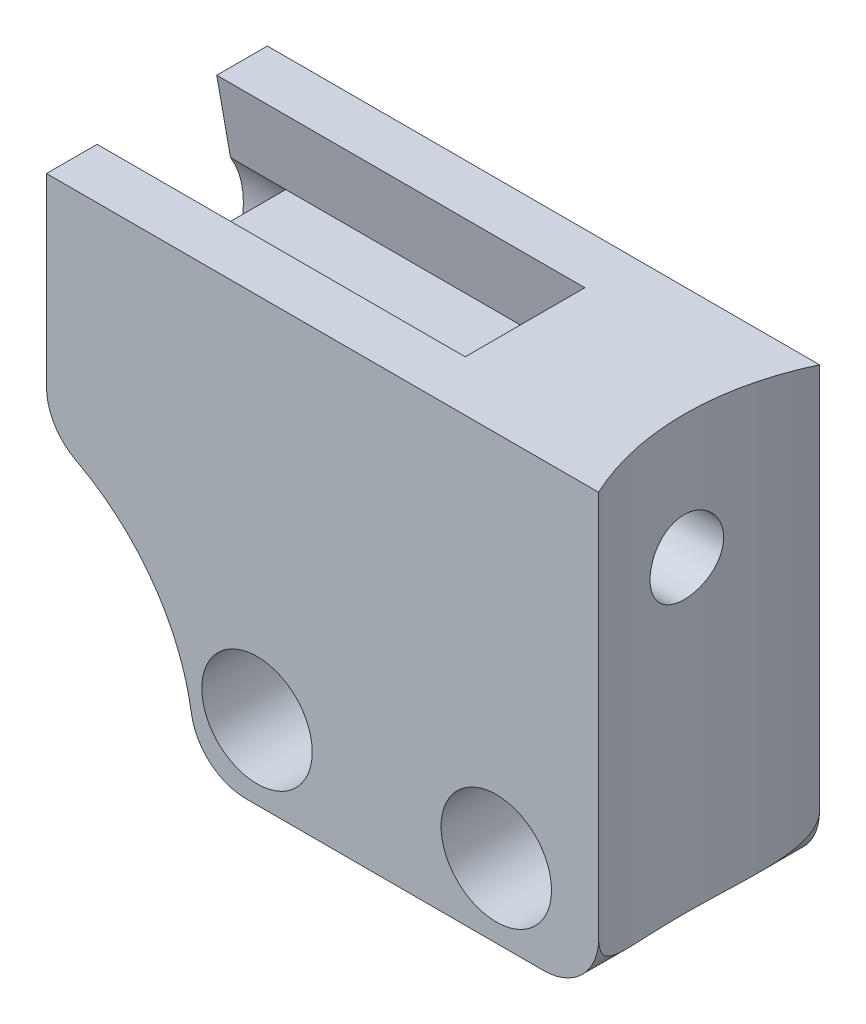
ISO-10303-21;
HEADER;
FILE_DESCRIPTION(('STEP AP214'),'2;1');
FILE_NAME('part.step','',(''),(''),'','','');
FILE_SCHEMA(('AUTOMOTIVE_DESIGN { 1 0 10303 214 1 1 1 1 }'));
ENDSEC;
DATA;
#1=APPLICATION_CONTEXT('core data for automotive mechanical design processes');
#2=APPLICATION_PROTOCOL_DEFINITION('international standard','automotive_design',2000,#1);
#3=PRODUCT_CONTEXT('',#1,'mechanical');
#4=PRODUCT('Part','Part','',(#3));
#5=PRODUCT_RELATED_PRODUCT_CATEGORY('part','',(#4));
#6=PRODUCT_DEFINITION_FORMATION('','',#4);
#7=PRODUCT_DEFINITION_CONTEXT('part definition',#1,'design');
#8=PRODUCT_DEFINITION('design','',#6,#7);
#9=PRODUCT_DEFINITION_SHAPE('','',#8);
#10=(LENGTH_UNIT() NAMED_UNIT(*) SI_UNIT(.MILLI.,.METRE.));
#11=(NAMED_UNIT(*) PLANE_ANGLE_UNIT() SI_UNIT($,.RADIAN.));
#12=(NAMED_UNIT(*) SI_UNIT($,.STERADIAN.) SOLID_ANGLE_UNIT());
#13=UNCERTAINTY_MEASURE_WITH_UNIT(LENGTH_MEASURE(1.E-05),#10,'distance_accuracy_value','');
#14=(GEOMETRIC_REPRESENTATION_CONTEXT(3) GLOBAL_UNCERTAINTY_ASSIGNED_CONTEXT((#13)) GLOBAL_UNIT_ASSIGNED_CONTEXT((#10,
#11,#12)) REPRESENTATION_CONTEXT('',''));
#15=CARTESIAN_POINT('',(0.,0.,0.));
#16=DIRECTION('',(0.,0.,1.));
#17=DIRECTION('',(1.,0.,0.));
#18=AXIS2_PLACEMENT_3D('',#15,#16,#17);
#19=CARTESIAN_POINT('',(-15.,12.,6.));
#20=DIRECTION('',(1.,0.,0.));
#21=DIRECTION('',(0.,0.,-1.));
#22=AXIS2_PLACEMENT_3D('',#19,#20,#21);
#23=PLANE('',#22);
#24=DIRECTION('',(0.,-0.984807753012207,0.173648177666935));
#25=VECTOR('',#24,1.);
#26=CARTESIAN_POINT('',(-15.,0.917627008188793,5.20412136873116));
#27=LINE('',#26,#25);
#28=CARTESIAN_POINT('',(-15.,12.,3.25));
#29=VERTEX_POINT('',#28);
#30=CARTESIAN_POINT('',(-15.,7.74653863528683,4.));
#31=VERTEX_POINT('',#30);
#32=EDGE_CURVE('E233',#29,#31,#27,.T.);
#33=ORIENTED_EDGE('',*,*,#32,.T.);
#34=CARTESIAN_POINT('',(-15.,5.27874609943621,0.));
#35=DIRECTION('',(-1.,0.,0.));
#36=DIRECTION('',(0.,0.,1.));
#37=AXIS2_PLACEMENT_3D('',#34,#35,#36);
#38=CIRCLE('',#37,4.7);
#39=CARTESIAN_POINT('',(-15.,1.95614318103448,3.32420063272786));
#40=VERTEX_POINT('',#39);
#41=EDGE_CURVE('E237',#40,#31,#38,.T.);
#42=ORIENTED_EDGE('',*,*,#41,.F.);
#43=DIRECTION('',(0.,0.,-1.));
#44=VECTOR('',#43,1.);
#45=CARTESIAN_POINT('',(-15.,1.95614318103448,6.));
#46=LINE('',#45,#44);
#47=CARTESIAN_POINT('',(-15.,1.95614318103448,6.));
#48=VERTEX_POINT('',#47);
#49=EDGE_CURVE('E11',#48,#40,#46,.T.);
#50=ORIENTED_EDGE('',*,*,#49,.F.);
#51=DIRECTION('',(0.,-1.,0.));
#52=VECTOR('',#51,1.);
#53=CARTESIAN_POINT('',(-15.,12.,6.));
#54=LINE('',#53,#52);
#55=CARTESIAN_POINT('',(-15.,12.,6.));
#56=VERTEX_POINT('',#55);
#57=EDGE_CURVE('E186',#56,#48,#54,.T.);
#58=ORIENTED_EDGE('',*,*,#57,.F.);
#59=DIRECTION('',(0.,0.,-1.));
#60=VECTOR('',#59,1.);
#61=CARTESIAN_POINT('',(-15.,12.,6.));
#62=LINE('',#61,#60);
#63=EDGE_CURVE('E187',#56,#29,#62,.T.);
#64=ORIENTED_EDGE('',*,*,#63,.T.);
#65=EDGE_LOOP('',(#33,#42,#50,#58,#64));
#66=FACE_BOUND('',#65,.T.);
#67=ADVANCED_FACE('F38',(#66),#23,.F.);
#68=CARTESIAN_POINT('',(5.,7.74653863528683,0.));
#69=DIRECTION('',(0.,1.,0.));
#70=DIRECTION('',(0.,0.,1.));
#71=AXIS2_PLACEMENT_3D('',#68,#69,#70);
#72=PLANE('',#71);
#73=DIRECTION('',(-1.,0.,0.));
#74=VECTOR('',#73,1.);
#75=CARTESIAN_POINT('',(5.,7.74653863528683,-4.));
#76=LINE('',#75,#74);
#77=CARTESIAN_POINT('',(5.,7.74653863528683,-4.));
#78=VERTEX_POINT('',#77);
#79=CARTESIAN_POINT('',(-12.,7.74653863528683,-4.));
#80=VERTEX_POINT('',#79);
#81=EDGE_CURVE('E257',#78,#80,#76,.T.);
#82=ORIENTED_EDGE('',*,*,#81,.T.);
#83=DIRECTION('',(0.,0.,-1.));
#84=VECTOR('',#83,1.);
#85=CARTESIAN_POINT('',(-12.,7.74653863528683,-4.));
#86=LINE('',#85,#84);
#87=CARTESIAN_POINT('',(-12.,7.74653863528683,4.));
#88=VERTEX_POINT('',#87);
#89=EDGE_CURVE('E388',#88,#80,#86,.T.);
#90=ORIENTED_EDGE('',*,*,#89,.F.);
#91=DIRECTION('',(-1.,0.,0.));
#92=VECTOR('',#91,1.);
#93=CARTESIAN_POINT('',(5.,7.74653863528683,4.));
#94=LINE('',#93,#92);
#95=CARTESIAN_POINT('',(5.,7.74653863528683,4.));
#96=VERTEX_POINT('',#95);
#97=EDGE_CURVE('E269',#96,#88,#94,.T.);
#98=ORIENTED_EDGE('',*,*,#97,.F.);
#99=DIRECTION('',(0.,0.,-1.));
#100=VECTOR('',#99,1.);
#101=CARTESIAN_POINT('',(5.,7.74653863528683,0.));
#102=LINE('',#101,#100);
#103=EDGE_CURVE('E249',#96,#78,#102,.T.);
#104=ORIENTED_EDGE('',*,*,#103,.T.);
#105=EDGE_LOOP('',(#82,#90,#98,#104));
#106=FACE_BOUND('',#105,.T.);
#107=ADVANCED_FACE('F216',(#106),#72,.T.);
#108=CARTESIAN_POINT('',(-15.,1.95614318103448,-3.32420063272786));
#109=VERTEX_POINT('',#108);
#110=CARTESIAN_POINT('',(-15.,1.95614318103448,-6.));
#111=VERTEX_POINT('',#110);
#112=EDGE_CURVE('E53',#109,#111,#46,.T.);
#113=ORIENTED_EDGE('',*,*,#112,.F.);
#114=CARTESIAN_POINT('',(-15.,7.74653863528683,-4.));
#115=VERTEX_POINT('',#114);
#116=EDGE_CURVE('E381',#115,#109,#38,.T.);
#117=ORIENTED_EDGE('',*,*,#116,.F.);
#118=DIRECTION('',(0.,0.984807753012207,0.173648177666935));
#119=VECTOR('',#118,1.);
#120=CARTESIAN_POINT('',(-15.,0.917627008188794,-5.20412136873116));
#121=LINE('',#120,#119);
#122=CARTESIAN_POINT('',(-15.,12.,-3.25));
#123=VERTEX_POINT('',#122);
#124=EDGE_CURVE('E245',#115,#123,#121,.T.);
#125=ORIENTED_EDGE('',*,*,#124,.T.);
#126=CARTESIAN_POINT('',(-15.,12.,-6.));
#127=VERTEX_POINT('',#126);
#128=EDGE_CURVE('E101',#123,#127,#62,.T.);
#129=ORIENTED_EDGE('',*,*,#128,.T.);
#130=DIRECTION('',(0.,-1.,0.));
#131=VECTOR('',#130,1.);
#132=CARTESIAN_POINT('',(-15.,12.,-6.));
#133=LINE('',#132,#131);
#134=EDGE_CURVE('E160',#127,#111,#133,.T.);
#135=ORIENTED_EDGE('',*,*,#134,.T.);
#136=EDGE_LOOP('',(#113,#117,#125,#129,#135));
#137=FACE_BOUND('',#136,.T.);
#138=ADVANCED_FACE('F40',(#137),#23,.F.);
#139=CARTESIAN_POINT('',(-15.,12.,6.));
#140=DIRECTION('',(0.,-1.,0.));
#141=DIRECTION('',(0.,0.,-1.));
#142=AXIS2_PLACEMENT_3D('',#139,#140,#141);
#143=PLANE('',#142);
#144=DIRECTION('',(-1.,0.,0.));
#145=VECTOR('',#144,1.);
#146=CARTESIAN_POINT('',(-15.,12.,6.));
#147=LINE('',#146,#145);
#148=CARTESIAN_POINT('',(15.,12.,6.));
#149=VERTEX_POINT('',#148);
#150=EDGE_CURVE('E69',#149,#56,#147,.T.);
#151=ORIENTED_EDGE('',*,*,#150,.F.);
#152=CARTESIAN_POINT('',(27.6491106406735,12.,0.));
#153=DIRECTION('',(0.,1.,0.));
#154=DIRECTION('',(0.,0.,1.));
#155=AXIS2_PLACEMENT_3D('',#152,#153,#154);
#156=CIRCLE('',#155,14.);
#157=CARTESIAN_POINT('',(15.,12.,-6.));
#158=VERTEX_POINT('',#157);
#159=EDGE_CURVE('E359',#158,#149,#156,.T.);
#160=ORIENTED_EDGE('',*,*,#159,.F.);
#161=DIRECTION('',(-1.,0.,0.));
#162=VECTOR('',#161,1.);
#163=CARTESIAN_POINT('',(-15.,12.,-6.));
#164=LINE('',#163,#162);
#165=EDGE_CURVE('E183',#158,#127,#164,.T.);
#166=ORIENTED_EDGE('',*,*,#165,.T.);
#167=ORIENTED_EDGE('',*,*,#128,.F.);
#168=DIRECTION('',(-1.,0.,0.));
#169=VECTOR('',#168,1.);
#170=CARTESIAN_POINT('',(5.,12.,-3.25));
#171=LINE('',#170,#169);
#172=CARTESIAN_POINT('',(5.,12.,-3.25));
#173=VERTEX_POINT('',#172);
#174=EDGE_CURVE('E262',#173,#123,#171,.T.);
#175=ORIENTED_EDGE('',*,*,#174,.F.);
#176=DIRECTION('',(0.,0.,-1.));
#177=VECTOR('',#176,1.);
#178=CARTESIAN_POINT('',(5.,12.,0.));
#179=LINE('',#178,#177);
#180=CARTESIAN_POINT('',(5.,12.,3.25));
#181=VERTEX_POINT('',#180);
#182=EDGE_CURVE('E294',#181,#173,#179,.T.);
#183=ORIENTED_EDGE('',*,*,#182,.F.);
#184=DIRECTION('',(-1.,0.,0.));
#185=VECTOR('',#184,1.);
#186=CARTESIAN_POINT('',(5.,12.,3.25));
#187=LINE('',#186,#185);
#188=EDGE_CURVE('E266',#181,#29,#187,.T.);
#189=ORIENTED_EDGE('',*,*,#188,.T.);
#190=ORIENTED_EDGE('',*,*,#63,.F.);
#191=EDGE_LOOP('',(#151,#160,#166,#167,#175,#183,#189,#190));
#192=FACE_BOUND('',#191,.T.);
#193=ADVANCED_FACE('F215',(#192),#143,.F.);
#194=CARTESIAN_POINT('',(-12.,1.95614318103448,6.));
#195=DIRECTION('',(0.,0.,-1.));
#196=DIRECTION('',(-1.,0.,0.));
#197=AXIS2_PLACEMENT_3D('',#194,#195,#196);
#198=PLANE('',#197);
#199=ORIENTED_EDGE('',*,*,#57,.T.);
#200=CARTESIAN_POINT('',(-12.,1.95614318103448,6.));
#201=DIRECTION('',(0.,0.,1.));
#202=DIRECTION('',(-1.,0.,0.));
#203=AXIS2_PLACEMENT_3D('',#200,#201,#202);
#204=CIRCLE('',#203,3.);
#205=CARTESIAN_POINT('',(-13.3961492122268,-0.699184929990292,6.));
#206=VERTEX_POINT('',#205);
#207=EDGE_CURVE('E109',#48,#206,#204,.T.);
#208=ORIENTED_EDGE('',*,*,#207,.T.);
#209=CARTESIAN_POINT('',(-18.9807460611341,-11.3204973740894,6.));
#210=DIRECTION('',(0.,0.,-1.));
#211=DIRECTION('',(-1.,0.,0.));
#212=AXIS2_PLACEMENT_3D('',#209,#210,#211);
#213=CIRCLE('',#212,12.);
#214=CARTESIAN_POINT('',(-7.12520782621706,-9.46409947481789,6.));
#215=VERTEX_POINT('',#214);
#216=EDGE_CURVE('E128',#206,#215,#213,.T.);
#217=ORIENTED_EDGE('',*,*,#216,.T.);
#218=CARTESIAN_POINT('',(-4.16132326748779,-9.,6.));
#219=DIRECTION('',(0.,0.,1.));
#220=DIRECTION('',(-1.,0.,0.));
#221=AXIS2_PLACEMENT_3D('',#218,#219,#220);
#222=CIRCLE('',#221,3.);
#223=CARTESIAN_POINT('',(-4.16132326748779,-12.,6.));
#224=VERTEX_POINT('',#223);
#225=EDGE_CURVE('E119',#215,#224,#222,.T.);
#226=ORIENTED_EDGE('',*,*,#225,.T.);
#227=DIRECTION('',(1.,0.,0.));
#228=VECTOR('',#227,1.);
#229=CARTESIAN_POINT('',(-4.16132326748779,-12.,6.));
#230=LINE('',#229,#228);
#231=CARTESIAN_POINT('',(12.,-12.,6.));
#232=VERTEX_POINT('',#231);
#233=EDGE_CURVE('E125',#224,#232,#230,.T.);
#234=ORIENTED_EDGE('',*,*,#233,.T.);
#235=CARTESIAN_POINT('',(12.,-9.,6.));
#236=DIRECTION('',(0.,0.,1.));
#237=DIRECTION('',(1.,0.,0.));
#238=AXIS2_PLACEMENT_3D('',#235,#236,#237);
#239=CIRCLE('',#238,3.);
#240=CARTESIAN_POINT('',(15.,-8.99999999999998,6.));
#241=VERTEX_POINT('',#240);
#242=EDGE_CURVE('E149',#232,#241,#239,.T.);
#243=ORIENTED_EDGE('',*,*,#242,.T.);
#244=DIRECTION('',(0.,1.,0.));
#245=VECTOR('',#244,1.);
#246=CARTESIAN_POINT('',(15.,12.,6.));
#247=LINE('',#246,#245);
#248=EDGE_CURVE('E152',#241,#149,#247,.T.);
#249=ORIENTED_EDGE('',*,*,#248,.T.);
#250=ORIENTED_EDGE('',*,*,#150,.T.);
#251=EDGE_LOOP('',(#199,#208,#217,#226,#234,#243,#249,#250));
#252=FACE_BOUND('',#251,.T.);
#253=CARTESIAN_POINT('',(-3.561872909699,-8.,6.));
#254=DIRECTION('',(0.,0.,1.));
#255=DIRECTION('',(1.,0.,0.));
#256=AXIS2_PLACEMENT_3D('',#253,#254,#255);
#257=CIRCLE('',#256,3.);
#258=CARTESIAN_POINT('',(-0.561872909699004,-8.,6.));
#259=VERTEX_POINT('',#258);
#260=EDGE_CURVE('E164',#259,#259,#257,.T.);
#261=ORIENTED_EDGE('',*,*,#260,.F.);
#262=EDGE_LOOP('',(#261));
#263=FACE_BOUND('',#262,.T.);
#264=CARTESIAN_POINT('',(9.43812709030099,-8.,6.));
#265=DIRECTION('',(0.,0.,1.));
#266=DIRECTION('',(1.,0.,0.));
#267=AXIS2_PLACEMENT_3D('',#264,#265,#266);
#268=CIRCLE('',#267,3.);
#269=CARTESIAN_POINT('',(12.438127090301,-8.,6.));
#270=VERTEX_POINT('',#269);
#271=EDGE_CURVE('E273',#270,#270,#268,.T.);
#272=ORIENTED_EDGE('',*,*,#271,.F.);
#273=EDGE_LOOP('',(#272));
#274=FACE_BOUND('',#273,.T.);
#275=ADVANCED_FACE('F121',(#252,#263,#274),#198,.F.);
#276=CARTESIAN_POINT('',(-12.,1.95614318103448,-6.));
#277=DIRECTION('',(0.,0.,-1.));
#278=DIRECTION('',(-1.,0.,0.));
#279=AXIS2_PLACEMENT_3D('',#276,#277,#278);
#280=PLANE('',#279);
#281=CARTESIAN_POINT('',(-3.561872909699,-8.,-6.));
#282=DIRECTION('',(0.,0.,1.));
#283=DIRECTION('',(1.,0.,0.));
#284=AXIS2_PLACEMENT_3D('',#281,#282,#283);
#285=CIRCLE('',#284,3.);
#286=CARTESIAN_POINT('',(-0.561872909699004,-8.,-6.));
#287=VERTEX_POINT('',#286);
#288=EDGE_CURVE('E277',#287,#287,#285,.T.);
#289=ORIENTED_EDGE('',*,*,#288,.T.);
#290=EDGE_LOOP('',(#289));
#291=FACE_BOUND('',#290,.T.);
#292=ORIENTED_EDGE('',*,*,#134,.F.);
#293=ORIENTED_EDGE('',*,*,#165,.F.);
#294=DIRECTION('',(0.,1.,0.));
#295=VECTOR('',#294,1.);
#296=CARTESIAN_POINT('',(15.,12.,-6.));
#297=LINE('',#296,#295);
#298=CARTESIAN_POINT('',(15.,-8.99999999999998,-6.));
#299=VERTEX_POINT('',#298);
#300=EDGE_CURVE('E179',#299,#158,#297,.T.);
#301=ORIENTED_EDGE('',*,*,#300,.F.);
#302=CARTESIAN_POINT('',(12.,-9.,-6.));
#303=DIRECTION('',(0.,0.,1.));
#304=DIRECTION('',(1.,0.,0.));
#305=AXIS2_PLACEMENT_3D('',#302,#303,#304);
#306=CIRCLE('',#305,3.);
#307=CARTESIAN_POINT('',(12.,-12.,-6.));
#308=VERTEX_POINT('',#307);
#309=EDGE_CURVE('E175',#308,#299,#306,.T.);
#310=ORIENTED_EDGE('',*,*,#309,.F.);
#311=DIRECTION('',(1.,0.,0.));
#312=VECTOR('',#311,1.);
#313=CARTESIAN_POINT('',(-4.16132326748779,-12.,-6.));
#314=LINE('',#313,#312);
#315=CARTESIAN_POINT('',(-4.16132326748779,-12.,-6.));
#316=VERTEX_POINT('',#315);
#317=EDGE_CURVE('E172',#316,#308,#314,.T.);
#318=ORIENTED_EDGE('',*,*,#317,.F.);
#319=CARTESIAN_POINT('',(-4.16132326748779,-9.,-6.));
#320=DIRECTION('',(0.,0.,1.));
#321=DIRECTION('',(-1.,0.,0.));
#322=AXIS2_PLACEMENT_3D('',#319,#320,#321);
#323=CIRCLE('',#322,3.);
#324=CARTESIAN_POINT('',(-7.12520782621706,-9.46409947481789,-6.));
#325=VERTEX_POINT('',#324);
#326=EDGE_CURVE('E138',#325,#316,#323,.T.);
#327=ORIENTED_EDGE('',*,*,#326,.F.);
#328=CARTESIAN_POINT('',(-18.9807460611341,-11.3204973740894,-6.));
#329=DIRECTION('',(0.,0.,-1.));
#330=DIRECTION('',(-1.,0.,0.));
#331=AXIS2_PLACEMENT_3D('',#328,#329,#330);
#332=CIRCLE('',#331,12.);
#333=CARTESIAN_POINT('',(-13.3961492122268,-0.699184929990292,-6.));
#334=VERTEX_POINT('',#333);
#335=EDGE_CURVE('E167',#334,#325,#332,.T.);
#336=ORIENTED_EDGE('',*,*,#335,.F.);
#337=CARTESIAN_POINT('',(-12.,1.95614318103448,-6.));
#338=DIRECTION('',(0.,0.,1.));
#339=DIRECTION('',(-1.,0.,0.));
#340=AXIS2_PLACEMENT_3D('',#337,#338,#339);
#341=CIRCLE('',#340,3.);
#342=EDGE_CURVE('E163',#111,#334,#341,.T.);
#343=ORIENTED_EDGE('',*,*,#342,.F.);
#344=EDGE_LOOP('',(#292,#293,#301,#310,#318,#327,#336,#343));
#345=FACE_BOUND('',#344,.T.);
#346=CARTESIAN_POINT('',(9.43812709030099,-8.,-6.));
#347=DIRECTION('',(0.,0.,1.));
#348=DIRECTION('',(1.,0.,0.));
#349=AXIS2_PLACEMENT_3D('',#346,#347,#348);
#350=CIRCLE('',#349,3.);
#351=CARTESIAN_POINT('',(12.438127090301,-8.,-6.));
#352=VERTEX_POINT('',#351);
#353=EDGE_CURVE('E261',#352,#352,#350,.T.);
#354=ORIENTED_EDGE('',*,*,#353,.T.);
#355=EDGE_LOOP('',(#354));
#356=FACE_BOUND('',#355,.T.);
#357=ADVANCED_FACE('F211',(#291,#345,#356),#280,.T.);
#358=CARTESIAN_POINT('',(-12.,1.95614318103448,6.));
#359=DIRECTION('',(0.,0.,-1.));
#360=DIRECTION('',(-1.,0.,0.));
#361=AXIS2_PLACEMENT_3D('',#358,#359,#360);
#362=CYLINDRICAL_SURFACE('',#361,3.);
#363=ORIENTED_EDGE('',*,*,#49,.T.);
#364=CARTESIAN_POINT('',(-15.,1.95614318103448,3.32420063272786));
#365=CARTESIAN_POINT('',(-14.9999853492437,1.86554611243241,3.23367334666578));
#366=CARTESIAN_POINT('',(-14.9958987580165,1.77876069865678,3.13950308055395));
#367=CARTESIAN_POINT('',(-14.9815198163408,1.61346109581234,2.94481283805304));
#368=CARTESIAN_POINT('',(-14.9712361962264,1.53493545288971,2.84430197227942));
#369=CARTESIAN_POINT('',(-14.946401708754,1.38661298595762,2.63770157408162));
#370=CARTESIAN_POINT('',(-14.9318547216636,1.31680830667452,2.53161718609469));
#371=CARTESIAN_POINT('',(-14.9002767592043,1.18613693643151,2.31444031992138));
#372=CARTESIAN_POINT('',(-14.8832449400282,1.12527329584504,2.20334614938658));
#373=CARTESIAN_POINT('',(-14.8326816321992,0.961894478072842,1.87422394149082));
#374=CARTESIAN_POINT('',(-14.7981322499798,0.871365166648422,1.65017850090573));
#375=CARTESIAN_POINT('',(-14.7523819732861,0.762018820061563,1.30528286255728));
#376=CARTESIAN_POINT('',(-14.7381425582322,0.729975249974017,1.18882889728025));
#377=CARTESIAN_POINT('',(-14.7128084428311,0.674895473986895,0.953487642734694));
#378=CARTESIAN_POINT('',(-14.7017122907268,0.651855107967622,0.834601504091045));
#379=CARTESIAN_POINT('',(-14.6828707391036,0.613495442549263,0.585328534905683));
#380=CARTESIAN_POINT('',(-14.6754721277252,0.598958446365982,0.45479406696794));
#381=CARTESIAN_POINT('',(-14.6662173282581,0.580864965952768,0.192761436168965));
#382=CARTESIAN_POINT('',(-14.6643612214943,0.577308642841419,0.06126325919568));
#383=CARTESIAN_POINT('',(-14.6663869783557,0.581230521402521,-0.201555291109623));
#384=CARTESIAN_POINT('',(-14.6702702827207,0.588711493719387,-0.332875611511738));
#385=CARTESIAN_POINT('',(-14.6833713176186,0.614604283729218,-0.594153771434415));
#386=CARTESIAN_POINT('',(-14.6925889745347,0.633015950573117,-0.724111629732449));
#387=CARTESIAN_POINT('',(-14.7143299519097,0.678263825408003,-0.969320697991197));
#388=CARTESIAN_POINT('',(-14.726452435239,0.704125027826276,-1.08478898546055));
#389=CARTESIAN_POINT('',(-14.7533208773752,0.764376474484577,-1.31317851537968));
#390=CARTESIAN_POINT('',(-14.7680679673267,0.798770398657567,-1.42609863589051));
#391=CARTESIAN_POINT('',(-14.814565795663,0.914435182632702,-1.76018106445702));
#392=CARTESIAN_POINT('',(-14.8485967110233,1.00823045487784,-1.97688790020134));
#393=CARTESIAN_POINT('',(-14.8963829125117,1.17243766574704,-2.28956621500657));
#394=CARTESIAN_POINT('',(-14.9117636561676,1.23106877066709,-2.39169637424327));
#395=CARTESIAN_POINT('',(-14.9400570384532,1.35600268130087,-2.59151475199769));
#396=CARTESIAN_POINT('',(-14.9529704966426,1.42230292776182,-2.68920443726451));
#397=CARTESIAN_POINT('',(-14.9748984123526,1.56242200155037,-2.87974482459751));
#398=CARTESIAN_POINT('',(-14.9839071127704,1.63625173358365,-2.97258820529847));
#399=CARTESIAN_POINT('',(-14.9964560134676,1.79100178589984,-3.15274415225616));
#400=CARTESIAN_POINT('',(-14.999989380676,1.87193083314233,-3.24004967738026));
#401=CARTESIAN_POINT('',(-15.,1.95614318103448,-3.32420063272786));
#402=B_SPLINE_CURVE_WITH_KNOTS('',3,(#364,#365,#366,#367,#368,#369,#370,#371,#372,#373,#374,
#375,#376,#377,#378,#379,#380,#381,#382,#383,#384,#385,#386,#387,#388,#389,#390,#391,#392,#393,
#394,#395,#396,#397,#398,#399,#400,#401),.UNSPECIFIED.,.F.,.F.,(4,2,2,2,2,2,2,2,2,2,2,2,2,2,2,2,
2,2,4),(0.,0.383876679098062,0.767213815409922,1.15020313841865,1.53332282220381,
2.2622224102059,2.62677782030571,2.99116458015716,3.38524874711381,3.77933869641013,
4.1735275892309,4.56771104217371,4.92416606099024,5.28077507730921,5.99331728155804,
6.34934883348664,6.70526191579859,7.06169797942871,7.41857850860744),.UNSPECIFIED.);
#403=EDGE_CURVE('E207',#40,#109,#402,.T.);
#404=ORIENTED_EDGE('',*,*,#403,.T.);
#405=ORIENTED_EDGE('',*,*,#112,.T.);
#406=ORIENTED_EDGE('',*,*,#342,.T.);
#407=DIRECTION('',(0.,0.,-1.));
#408=VECTOR('',#407,1.);
#409=CARTESIAN_POINT('',(-13.3961492122268,-0.699184929990292,6.));
#410=LINE('',#409,#408);
#411=EDGE_CURVE('E195',#206,#334,#410,.T.);
#412=ORIENTED_EDGE('',*,*,#411,.F.);
#413=ORIENTED_EDGE('',*,*,#207,.F.);
#414=EDGE_LOOP('',(#363,#404,#405,#406,#412,#413));
#415=FACE_BOUND('',#414,.T.);
#416=ADVANCED_FACE('F204',(#415),#362,.T.);
#417=CARTESIAN_POINT('',(-18.9807460611341,-11.3204973740894,6.));
#418=DIRECTION('',(0.,0.,-1.));
#419=DIRECTION('',(-1.,0.,0.));
#420=AXIS2_PLACEMENT_3D('',#417,#418,#419);
#421=CYLINDRICAL_SURFACE('',#420,12.);
#422=ORIENTED_EDGE('',*,*,#335,.T.);
#423=DIRECTION('',(0.,0.,-1.));
#424=VECTOR('',#423,1.);
#425=CARTESIAN_POINT('',(-7.12520782621706,-9.46409947481789,6.));
#426=LINE('',#425,#424);
#427=EDGE_CURVE('E142',#215,#325,#426,.T.);
#428=ORIENTED_EDGE('',*,*,#427,.F.);
#429=ORIENTED_EDGE('',*,*,#216,.F.);
#430=ORIENTED_EDGE('',*,*,#411,.T.);
#431=EDGE_LOOP('',(#422,#428,#429,#430));
#432=FACE_BOUND('',#431,.T.);
#433=ADVANCED_FACE('F429',(#432),#421,.F.);
#434=CARTESIAN_POINT('',(-4.16132326748779,-9.,6.));
#435=DIRECTION('',(0.,0.,-1.));
#436=DIRECTION('',(-1.,0.,0.));
#437=AXIS2_PLACEMENT_3D('',#434,#435,#436);
#438=CYLINDRICAL_SURFACE('',#437,3.);
#439=ORIENTED_EDGE('',*,*,#326,.T.);
#440=DIRECTION('',(0.,0.,-1.));
#441=VECTOR('',#440,1.);
#442=CARTESIAN_POINT('',(-4.16132326748779,-12.,6.));
#443=LINE('',#442,#441);
#444=EDGE_CURVE('E135',#224,#316,#443,.T.);
#445=ORIENTED_EDGE('',*,*,#444,.F.);
#446=ORIENTED_EDGE('',*,*,#225,.F.);
#447=ORIENTED_EDGE('',*,*,#427,.T.);
#448=EDGE_LOOP('',(#439,#445,#446,#447));
#449=FACE_BOUND('',#448,.T.);
#450=ADVANCED_FACE('F136',(#449),#438,.T.);
#451=CARTESIAN_POINT('',(-4.16132326748779,-12.,6.));
#452=DIRECTION('',(0.,1.,0.));
#453=DIRECTION('',(0.,0.,1.));
#454=AXIS2_PLACEMENT_3D('',#451,#452,#453);
#455=PLANE('',#454);
#456=ORIENTED_EDGE('',*,*,#317,.T.);
#457=DIRECTION('',(0.,0.,-1.));
#458=VECTOR('',#457,1.);
#459=CARTESIAN_POINT('',(12.,-12.,6.));
#460=LINE('',#459,#458);
#461=EDGE_CURVE('E143',#232,#308,#460,.T.);
#462=ORIENTED_EDGE('',*,*,#461,.F.);
#463=ORIENTED_EDGE('',*,*,#233,.F.);
#464=ORIENTED_EDGE('',*,*,#444,.T.);
#465=EDGE_LOOP('',(#456,#462,#463,#464));
#466=FACE_BOUND('',#465,.T.);
#467=ADVANCED_FACE('F145',(#466),#455,.F.);
#468=CARTESIAN_POINT('',(12.,-9.,6.));
#469=DIRECTION('',(0.,0.,-1.));
#470=DIRECTION('',(-1.,0.,0.));
#471=AXIS2_PLACEMENT_3D('',#468,#469,#470);
#472=CYLINDRICAL_SURFACE('',#471,3.);
#473=ORIENTED_EDGE('',*,*,#309,.T.);
#474=CARTESIAN_POINT('',(15.,-8.99999999999998,-6.00000000000001));
#475=CARTESIAN_POINT('',(15.0000043243055,-9.03868631510226,-6.00000657782793));
#476=CARTESIAN_POINT('',(14.9992509688993,-9.07735100505734,-5.99842111634692));
#477=CARTESIAN_POINT('',(14.9962739425547,-9.15434069491982,-5.99214002263668));
#478=CARTESIAN_POINT('',(14.9940514071054,-9.19266593401614,-5.98744679231228));
#479=CARTESIAN_POINT('',(14.9852991473146,-9.306085650778,-5.9689254948774));
#480=CARTESIAN_POINT('',(14.9766829957419,-9.38033762845913,-5.95065279558792));
#481=CARTESIAN_POINT('',(14.9547179317865,-9.52436284752303,-5.90364706701084));
#482=CARTESIAN_POINT('',(14.941382219478,-9.59414794587891,-5.87494320654241));
#483=CARTESIAN_POINT('',(14.9109837445074,-9.72865689914255,-5.80873973995464));
#484=CARTESIAN_POINT('',(14.8939128178982,-9.79336923913824,-5.77122085363036));
#485=CARTESIAN_POINT('',(14.8454622567116,-9.95627173712361,-5.66320698550601));
#486=CARTESIAN_POINT('',(14.8118415844091,-10.0498819617454,-5.5868243336825));
#487=CARTESIAN_POINT('',(14.7409464939748,-10.2231215110567,-5.42102147661569));
#488=CARTESIAN_POINT('',(14.7036623736556,-10.3027120619507,-5.33156632801317));
#489=CARTESIAN_POINT('',(14.6335347897429,-10.4385442889378,-5.15773522555036));
#490=CARTESIAN_POINT('',(14.6008615646657,-10.4964976979828,-5.07460188449948));
#491=CARTESIAN_POINT('',(14.5355579944975,-10.6046624269818,-4.9033804095072));
#492=CARTESIAN_POINT('',(14.5029276988317,-10.6548680030379,-4.81528866502642));
#493=CARTESIAN_POINT('',(14.4383711009922,-10.7485958461999,-4.63524768619275));
#494=CARTESIAN_POINT('',(14.4064457603835,-10.7921094159535,-4.54329362635495));
#495=CARTESIAN_POINT('',(14.343800130581,-10.8732915129647,-4.35642562129568));
#496=CARTESIAN_POINT('',(14.3130803035248,-10.9109578146963,-4.2615105655171));
#497=CARTESIAN_POINT('',(14.2249347050245,-11.0143926683122,-3.97865275175092));
#498=CARTESIAN_POINT('',(14.1696668310473,-11.0731338912596,-3.78745414397995));
#499=CARTESIAN_POINT('',(14.0665421695542,-11.1759287383275,-3.39916477809138));
#500=CARTESIAN_POINT('',(14.0186921427247,-11.2199690055406,-3.20206883798124));
#501=CARTESIAN_POINT('',(13.9311209235249,-11.2965536316602,-2.80330945357195));
#502=CARTESIAN_POINT('',(13.8914231078313,-11.3290651200244,-2.6016346663406));
#503=CARTESIAN_POINT('',(13.8208045198476,-11.3846771347174,-2.19554722884292));
#504=CARTESIAN_POINT('',(13.7898817074934,-11.4077798489976,-1.99113522653186));
#505=CARTESIAN_POINT('',(13.7430078911202,-11.4418337151343,-1.6266708259196));
#506=CARTESIAN_POINT('',(13.7252536183258,-11.4543495254939,-1.46698945687386));
#507=CARTESIAN_POINT('',(13.6952349140729,-11.4751796813055,-1.14682323303156));
#508=CARTESIAN_POINT('',(13.6829709819288,-11.483493644633,-0.986338306497682));
#509=CARTESIAN_POINT('',(13.6639762321703,-11.4962597975441,-0.664806153248101));
#510=CARTESIAN_POINT('',(13.6572483352027,-11.5007099487641,-0.503758674680129));
#511=CARTESIAN_POINT('',(13.6493582844464,-11.505920920724,-0.181448324229998));
#512=CARTESIAN_POINT('',(13.6481968185649,-11.5066812854753,-0.020185428189375));
#513=CARTESIAN_POINT('',(13.6514419315474,-11.504544524537,0.301923523702577));
#514=CARTESIAN_POINT('',(13.6558368918463,-11.501655030764,0.462769746964182));
#515=CARTESIAN_POINT('',(13.6701597023822,-11.4921157544757,0.78408471685413));
#516=CARTESIAN_POINT('',(13.6800868408705,-11.4854664556809,0.944553509374782));
#517=CARTESIAN_POINT('',(13.7054312573551,-11.4681450759342,1.26474525286657));
#518=CARTESIAN_POINT('',(13.7208452637762,-11.4574753919377,1.42446859094744));
#519=CARTESIAN_POINT('',(13.757101899533,-11.4316844059775,1.74291960729581));
#520=CARTESIAN_POINT('',(13.7779437774664,-11.4165637201464,1.90164742026568));
#521=CARTESIAN_POINT('',(13.8239214683532,-11.3820369549809,2.21076212662482));
#522=CARTESIAN_POINT('',(13.848826746265,-11.3628498538588,2.36120756792391));
#523=CARTESIAN_POINT('',(13.9033803565005,-11.3191306948213,2.66045578936482));
#524=CARTESIAN_POINT('',(13.9330284525257,-11.2945989031691,2.80925865094927));
#525=CARTESIAN_POINT('',(13.9968872812603,-11.239247405298,3.10477985577465));
#526=CARTESIAN_POINT('',(14.0310999020462,-11.20842509425,3.25149730846452));
#527=CARTESIAN_POINT('',(14.1037796617218,-11.1393066125293,3.54209281323172));
#528=CARTESIAN_POINT('',(14.1422459915486,-11.1010118620717,3.68597139915252));
#529=CARTESIAN_POINT('',(14.2142532209535,-11.0246492111103,3.93929073729185));
#530=CARTESIAN_POINT('',(14.2470646589166,-10.988317133902,4.04946041583884));
#531=CARTESIAN_POINT('',(14.3146738174358,-10.9091874617805,4.2668180322021));
#532=CARTESIAN_POINT('',(14.3494709745048,-10.8663916954468,4.37400680319485));
#533=CARTESIAN_POINT('',(14.420482531944,-10.7733258147391,4.5842859451679));
#534=CARTESIAN_POINT('',(14.4566931276757,-10.7230748664395,4.68738599069193));
#535=CARTESIAN_POINT('',(14.5298675251662,-10.6137219296142,4.88844373873727));
#536=CARTESIAN_POINT('',(14.5668306444066,-10.5546276775738,4.98640583597531));
#537=CARTESIAN_POINT('',(14.6394137179434,-10.427824969471,5.17276484627331));
#538=CARTESIAN_POINT('',(14.6750420680829,-10.3604078201519,5.26135406330389));
#539=CARTESIAN_POINT('',(14.7445129054268,-10.2141647450038,5.42951260634078));
#540=CARTESIAN_POINT('',(14.778356139317,-10.1353436417429,5.50908571988988));
#541=CARTESIAN_POINT('',(14.8370013609537,-9.97841258485898,5.64397027703847));
#542=CARTESIAN_POINT('',(14.8623887646641,-9.90213168280352,5.70112946958126));
#543=CARTESIAN_POINT('',(14.9084040161389,-9.7404123178632,5.80323466559771));
#544=CARTESIAN_POINT('',(14.9290386156748,-9.65498710131879,5.84819801067441));
#545=CARTESIAN_POINT('',(14.9596038530275,-9.49578790878808,5.91417327061582));
#546=CARTESIAN_POINT('',(14.9708889664072,-9.42355883298513,5.93827396964489));
#547=CARTESIAN_POINT('',(14.9882230790685,-9.27571494122548,5.97514464420929));
#548=CARTESIAN_POINT('',(14.9942848976777,-9.20010889618725,5.9879423621503));
#549=CARTESIAN_POINT('',(14.9982913337249,-9.10334828112857,5.99639650256274));
#550=CARTESIAN_POINT('',(14.9989316100053,-9.08270048784293,5.99774710398821));
#551=CARTESIAN_POINT('',(14.9997854398589,-9.041371102638,5.99954782677548));
#552=CARTESIAN_POINT('',(14.9999992868719,-9.02068954376872,5.99999856736085));
#553=CARTESIAN_POINT('',(15.,-9.00000000000004,6.00000000000067));
#554=B_SPLINE_CURVE_WITH_KNOTS('',3,(#474,#475,#476,#477,#478,#479,#480,#481,#482,#483,#484,
#485,#486,#487,#488,#489,#490,#491,#492,#493,#494,#495,#496,#497,#498,#499,#500,#501,#502,#503,
#504,#505,#506,#507,#508,#509,#510,#511,#512,#513,#514,#515,#516,#517,#518,#519,#520,#521,#522,
#523,#524,#525,#526,#527,#528,#529,#530,#531,#532,#533,#534,#535,#536,#537,#538,#539,#540,#541,
#542,#543,#544,#545,#546,#547,#548,#549,#550,#551,#552,#553),.UNSPECIFIED.,.F.,.F.,(4,2,2,2,2,2,
2,2,2,2,2,2,2,2,2,2,2,2,2,2,2,2,2,2,2,2,2,2,2,2,2,2,2,2,2,2,2,2,2,4),(0.,0.115978440825648,
0.231867349719321,0.461534914863907,0.690565137462781,0.920101036004709,1.29418067542735,
1.66927918438642,1.98825534975722,2.30746686542737,2.62708980488812,2.94683409918985,
3.56834306695349,4.19041519435522,4.81424696004487,5.43793357462489,5.92124380067539,
6.40459797202965,6.88820698339969,7.37187575828149,7.85453484564127,8.33713185028625,
8.81944158448487,9.30168458604012,9.76261043610151,10.2235133288779,10.6846074647029,
11.1456140499788,11.5070956943804,11.8684752664076,12.2289413919191,12.5890939907266,
12.9390483454712,13.2888551397755,13.583773698603,13.8782706798592,14.1082791886237,
14.3377215754368,14.3998110483178,14.4618577806615),.UNSPECIFIED.);
#555=EDGE_CURVE('E349',#299,#241,#554,.T.);
#556=ORIENTED_EDGE('',*,*,#555,.T.);
#557=ORIENTED_EDGE('',*,*,#242,.F.);
#558=ORIENTED_EDGE('',*,*,#461,.T.);
#559=EDGE_LOOP('',(#473,#556,#557,#558));
#560=FACE_BOUND('',#559,.T.);
#561=ADVANCED_FACE('F336',(#560),#472,.T.);
#562=CARTESIAN_POINT('',(-3.561872909699,-8.,6.));
#563=DIRECTION('',(0.,0.,-1.));
#564=DIRECTION('',(-1.,0.,0.));
#565=AXIS2_PLACEMENT_3D('',#562,#563,#564);
#566=CYLINDRICAL_SURFACE('',#565,3.);
#567=ORIENTED_EDGE('',*,*,#260,.T.);
#568=EDGE_LOOP('',(#567));
#569=FACE_BOUND('',#568,.T.);
#570=ORIENTED_EDGE('',*,*,#288,.F.);
#571=EDGE_LOOP('',(#570));
#572=FACE_BOUND('',#571,.T.);
#573=ADVANCED_FACE('F332',(#569,#572),#566,.F.);
#574=CARTESIAN_POINT('',(9.43812709030099,-8.,6.));
#575=DIRECTION('',(0.,0.,-1.));
#576=DIRECTION('',(-1.,0.,0.));
#577=AXIS2_PLACEMENT_3D('',#574,#575,#576);
#578=CYLINDRICAL_SURFACE('',#577,3.);
#579=ORIENTED_EDGE('',*,*,#271,.T.);
#580=EDGE_LOOP('',(#579));
#581=FACE_BOUND('',#580,.T.);
#582=ORIENTED_EDGE('',*,*,#353,.F.);
#583=EDGE_LOOP('',(#582));
#584=FACE_BOUND('',#583,.T.);
#585=ADVANCED_FACE('F326',(#581,#584),#578,.F.);
#586=CARTESIAN_POINT('',(5.,0.917627008188794,-5.20412136873116));
#587=DIRECTION('',(0.,-0.173648177666935,0.984807753012207));
#588=DIRECTION('',(0.,-0.984807753012207,-0.173648177666935));
#589=AXIS2_PLACEMENT_3D('',#586,#587,#588);
#590=PLANE('',#589);
#591=ORIENTED_EDGE('',*,*,#124,.F.);
#592=DIRECTION('',(-1.,0.,0.));
#593=VECTOR('',#592,1.);
#594=CARTESIAN_POINT('',(-12.,7.74653863528683,-4.));
#595=LINE('',#594,#593);
#596=EDGE_CURVE('E251',#80,#115,#595,.T.);
#597=ORIENTED_EDGE('',*,*,#596,.F.);
#598=ORIENTED_EDGE('',*,*,#81,.F.);
#599=DIRECTION('',(0.,0.984807753012207,0.173648177666935));
#600=VECTOR('',#599,1.);
#601=CARTESIAN_POINT('',(5.,0.917627008188794,-5.20412136873116));
#602=LINE('',#601,#600);
#603=EDGE_CURVE('E254',#78,#173,#602,.T.);
#604=ORIENTED_EDGE('',*,*,#603,.T.);
#605=ORIENTED_EDGE('',*,*,#174,.T.);
#606=EDGE_LOOP('',(#591,#597,#598,#604,#605));
#607=FACE_BOUND('',#606,.T.);
#608=ADVANCED_FACE('F323',(#607),#590,.T.);
#609=CARTESIAN_POINT('',(5.,0.917627008188793,5.20412136873116));
#610=DIRECTION('',(0.,-0.173648177666935,-0.984807753012207));
#611=DIRECTION('',(0.,0.984807753012207,-0.173648177666935));
#612=AXIS2_PLACEMENT_3D('',#609,#610,#611);
#613=PLANE('',#612);
#614=ORIENTED_EDGE('',*,*,#32,.F.);
#615=ORIENTED_EDGE('',*,*,#188,.F.);
#616=DIRECTION('',(0.,-0.984807753012207,0.173648177666935));
#617=VECTOR('',#616,1.);
#618=CARTESIAN_POINT('',(5.,0.917627008188793,5.20412136873116));
#619=LINE('',#618,#617);
#620=EDGE_CURVE('E60',#181,#96,#619,.T.);
#621=ORIENTED_EDGE('',*,*,#620,.T.);
#622=ORIENTED_EDGE('',*,*,#97,.T.);
#623=DIRECTION('',(-1.,0.,0.));
#624=VECTOR('',#623,1.);
#625=CARTESIAN_POINT('',(-12.,7.74653863528683,4.));
#626=LINE('',#625,#624);
#627=EDGE_CURVE('E308',#88,#31,#626,.T.);
#628=ORIENTED_EDGE('',*,*,#627,.T.);
#629=EDGE_LOOP('',(#614,#615,#621,#622,#628));
#630=FACE_BOUND('',#629,.T.);
#631=ADVANCED_FACE('F322',(#630),#613,.T.);
#632=CARTESIAN_POINT('',(5.,0.,0.));
#633=DIRECTION('',(-1.,0.,0.));
#634=DIRECTION('',(0.,0.,1.));
#635=AXIS2_PLACEMENT_3D('',#632,#633,#634);
#636=PLANE('',#635);
#637=ORIENTED_EDGE('',*,*,#103,.F.);
#638=ORIENTED_EDGE('',*,*,#620,.F.);
#639=ORIENTED_EDGE('',*,*,#182,.T.);
#640=ORIENTED_EDGE('',*,*,#603,.F.);
#641=EDGE_LOOP('',(#637,#638,#639,#640));
#642=FACE_BOUND('',#641,.T.);
#643=ADVANCED_FACE('F318',(#642),#636,.T.);
#644=CARTESIAN_POINT('',(-12.,5.27874609943621,0.));
#645=DIRECTION('',(-1.,0.,0.));
#646=DIRECTION('',(0.,0.,1.));
#647=AXIS2_PLACEMENT_3D('',#644,#645,#646);
#648=CYLINDRICAL_SURFACE('',#647,4.7);
#649=ORIENTED_EDGE('',*,*,#41,.T.);
#650=ORIENTED_EDGE('',*,*,#627,.F.);
#651=CARTESIAN_POINT('',(-12.,5.27874609943621,0.));
#652=DIRECTION('',(-1.,0.,0.));
#653=DIRECTION('',(0.,0.,1.));
#654=AXIS2_PLACEMENT_3D('',#651,#652,#653);
#655=CIRCLE('',#654,4.7);
#656=EDGE_CURVE('E386',#80,#88,#655,.T.);
#657=ORIENTED_EDGE('',*,*,#656,.F.);
#658=ORIENTED_EDGE('',*,*,#596,.T.);
#659=ORIENTED_EDGE('',*,*,#116,.T.);
#660=ORIENTED_EDGE('',*,*,#403,.F.);
#661=EDGE_LOOP('',(#649,#650,#657,#658,#659,#660));
#662=FACE_BOUND('',#661,.T.);
#663=ADVANCED_FACE('F312',(#662),#648,.F.);
#664=CARTESIAN_POINT('',(-12.,5.27874609943621,0.));
#665=DIRECTION('',(-1.,0.,0.));
#666=DIRECTION('',(0.,0.,1.));
#667=AXIS2_PLACEMENT_3D('',#664,#665,#666);
#668=PLANE('',#667);
#669=CARTESIAN_POINT('',(-12.,5.27874609943621,0.));
#670=DIRECTION('',(-1.,0.,0.));
#671=DIRECTION('',(0.,0.,1.));
#672=AXIS2_PLACEMENT_3D('',#669,#670,#671);
#673=CIRCLE('',#672,2.);
#674=CARTESIAN_POINT('',(-12.,5.27874609943621,2.));
#675=VERTEX_POINT('',#674);
#676=EDGE_CURVE('E358',#675,#675,#673,.T.);
#677=ORIENTED_EDGE('',*,*,#676,.F.);
#678=EDGE_LOOP('',(#677));
#679=FACE_BOUND('',#678,.T.);
#680=ORIENTED_EDGE('',*,*,#656,.T.);
#681=ORIENTED_EDGE('',*,*,#89,.T.);
#682=EDGE_LOOP('',(#680,#681));
#683=FACE_BOUND('',#682,.T.);
#684=ADVANCED_FACE('F317',(#679,#683),#668,.T.);
#685=CARTESIAN_POINT('',(15.,5.27874609943621,0.));
#686=DIRECTION('',(-1.,0.,0.));
#687=DIRECTION('',(0.,0.,1.));
#688=AXIS2_PLACEMENT_3D('',#685,#686,#687);
#689=CYLINDRICAL_SURFACE('',#688,2.);
#690=CARTESIAN_POINT('',(13.7927041801225,5.27874609943621,2.));
#691=CARTESIAN_POINT('',(13.792702383547,5.1670219281965,1.99999534115949));
#692=CARTESIAN_POINT('',(13.7913383209474,5.05523138666406,1.99060664506871));
#693=CARTESIAN_POINT('',(13.7860326493668,4.83477146301291,1.95330740137887));
#694=CARTESIAN_POINT('',(13.7820884718432,4.72610530392106,1.92537839621705));
#695=CARTESIAN_POINT('',(13.7720782142411,4.51511739940736,1.85184738836467));
#696=CARTESIAN_POINT('',(13.7660137055976,4.4127910213357,1.80625847122079));
#697=CARTESIAN_POINT('',(13.7524479746924,4.21725636996816,1.69873175889211));
#698=CARTESIAN_POINT('',(13.7449469647284,4.12404675239592,1.63679637900725));
#699=CARTESIAN_POINT('',(13.729292388118,3.94869780358889,1.49785346840196));
#700=CARTESIAN_POINT('',(13.7211348959462,3.86663438557033,1.42075056427329));
#701=CARTESIAN_POINT('',(13.7051216094891,3.71656454219563,1.25386707896715));
#702=CARTESIAN_POINT('',(13.6972658313179,3.64855886679594,1.16408582185113));
#703=CARTESIAN_POINT('',(13.6827002704446,3.52825700167653,0.973910384020491));
#704=CARTESIAN_POINT('',(13.6759956177388,3.47603038491778,0.873471766216092));
#705=CARTESIAN_POINT('',(13.6645311261444,3.38921536410839,0.665136745963096));
#706=CARTESIAN_POINT('',(13.6597711938371,3.35462611278882,0.557240702039329));
#707=CARTESIAN_POINT('',(13.6527601405837,3.30429689247195,0.33783406354095));
#708=CARTESIAN_POINT('',(13.6504921374924,3.28843002946998,0.226353125069878));
#709=CARTESIAN_POINT('',(13.6486626858352,3.27560220086961,0.00228956527839829));
#710=CARTESIAN_POINT('',(13.6491011001512,3.2786402774701,-0.11029299994058));
#711=CARTESIAN_POINT('',(13.6526215460409,3.30343547765203,-0.332498992185871));
#712=CARTESIAN_POINT('',(13.6556842993492,3.32505609831873,-0.442137999771036));
#713=CARTESIAN_POINT('',(13.6640877865472,3.38618865913542,-0.656215595128695));
#714=CARTESIAN_POINT('',(13.6694285745666,3.42570102442401,-0.760654059261884));
#715=CARTESIAN_POINT('',(13.6818212369637,3.52163684421978,-0.961781966767738));
#716=CARTESIAN_POINT('',(13.6888789589564,3.57811825055505,-1.05844339279107));
#717=CARTESIAN_POINT('',(13.7039179737112,3.70634659217648,-1.24096782013765));
#718=CARTESIAN_POINT('',(13.711899321674,3.77809444007943,-1.32683017541183));
#719=CARTESIAN_POINT('',(13.7279785912355,3.93558070111221,-1.48612299106386));
#720=CARTESIAN_POINT('',(13.7360769175612,4.02143823218541,-1.55943569332184));
#721=CARTESIAN_POINT('',(13.7514077019169,4.2043006208657,-1.69062989590123));
#722=CARTESIAN_POINT('',(13.7586401555105,4.30130553558183,-1.74851131716179));
#723=CARTESIAN_POINT('',(13.7714201038443,4.50382638934239,-1.84721301520795));
#724=CARTESIAN_POINT('',(13.7769664829748,4.60934790531882,-1.88802200251778));
#725=CARTESIAN_POINT('',(13.785725982584,4.8258436792621,-1.9513062370832));
#726=CARTESIAN_POINT('',(13.7889392515122,4.93681758982778,-1.97378265080303));
#727=CARTESIAN_POINT('',(13.7926408331003,5.16002263686625,-1.99960390688194));
#728=CARTESIAN_POINT('',(13.7931528686424,5.2722341254318,-2.00311531104472));
#729=CARTESIAN_POINT('',(13.7914569153464,5.49564390446136,-1.99134808247121));
#730=CARTESIAN_POINT('',(13.7892490028104,5.6068422232595,-1.9760699768337));
#731=CARTESIAN_POINT('',(13.7823836754219,5.82455827946466,-1.92729837855202));
#732=CARTESIAN_POINT('',(13.777737327221,5.93109482650156,-1.89388715844421));
#733=CARTESIAN_POINT('',(13.7665277285518,6.13705489689271,-1.80988306171463));
#734=CARTESIAN_POINT('',(13.7599643915774,6.23647809899794,-1.75928940970141));
#735=CARTESIAN_POINT('',(13.7456041565393,6.4261379791577,-1.64195360331226));
#736=CARTESIAN_POINT('',(13.7377991161505,6.51630706064857,-1.57510320027125));
#737=CARTESIAN_POINT('',(13.7218597320143,6.68420582306173,-1.42730277821365));
#738=CARTESIAN_POINT('',(13.7137253714441,6.76193486749534,-1.34635203820216));
#739=CARTESIAN_POINT('',(13.6979701165344,6.90334131787001,-1.17191708628535));
#740=CARTESIAN_POINT('',(13.690353545055,6.96690862175574,-1.07834317212433));
#741=CARTESIAN_POINT('',(13.6765584250755,7.07742166257194,-0.881748704771193));
#742=CARTESIAN_POINT('',(13.6703798402686,7.12436781917417,-0.778728390176454));
#743=CARTESIAN_POINT('',(13.6601758622291,7.20012821375193,-0.566515924593931));
#744=CARTESIAN_POINT('',(13.6561432041013,7.2290036880637,-0.457345999123928));
#745=CARTESIAN_POINT('',(13.6506550495083,7.26800156654283,-0.235645259045784));
#746=CARTESIAN_POINT('',(13.6491993993211,7.27812508929006,-0.123114645314278));
#747=CARTESIAN_POINT('',(13.6490305639543,7.27930633838069,0.101043130627157));
#748=CARTESIAN_POINT('',(13.6502930904496,7.27053291845465,0.212669421750583));
#749=CARTESIAN_POINT('',(13.6553699979231,7.23452994939318,0.432842633479871));
#750=CARTESIAN_POINT('',(13.6591843728765,7.20730044383234,0.541389561355441));
#751=CARTESIAN_POINT('',(13.668938420131,7.13521612200802,0.75228371449725));
#752=CARTESIAN_POINT('',(13.6748768124769,7.09037191895148,0.854634630206984));
#753=CARTESIAN_POINT('',(13.6882250396506,6.98434895023419,1.05038570585148));
#754=CARTESIAN_POINT('',(13.6956349132297,6.92316975437811,1.14378562996655));
#755=CARTESIAN_POINT('',(13.7111801660389,6.78559838421284,1.31984194960265));
#756=CARTESIAN_POINT('',(13.7193211820832,6.70908119260372,1.40240016631985));
#757=CARTESIAN_POINT('',(13.7353684064114,6.54326853920091,1.55356716727243));
#758=CARTESIAN_POINT('',(13.7432745590228,6.45397007643968,1.6221726663073));
#759=CARTESIAN_POINT('',(13.7579997621561,6.26460066110057,1.74379523475593));
#760=CARTESIAN_POINT('',(13.7648131004009,6.16447740902509,1.79673154300995));
#761=CARTESIAN_POINT('',(13.776514359314,5.95671380283169,1.88495902507096));
#762=CARTESIAN_POINT('',(13.7814043062919,5.84908150111902,1.92026877922144));
#763=CARTESIAN_POINT('',(13.7875577184963,5.66390967360568,1.96409255165575));
#764=CARTESIAN_POINT('',(13.7894776007795,5.58752176402565,1.97753762529532));
#765=CARTESIAN_POINT('',(13.7920514475105,5.43368190247038,1.99549291508544));
#766=CARTESIAN_POINT('',(13.7927054260983,5.35622996239009,2.00000323103726));
#767=CARTESIAN_POINT('',(13.7927041801225,5.27874609943621,2.));
#768=B_SPLINE_CURVE_WITH_KNOTS('',3,(#690,#691,#692,#693,#694,#695,#696,#697,#698,#699,#700,
#701,#702,#703,#704,#705,#706,#707,#708,#709,#710,#711,#712,#713,#714,#715,#716,#717,#718,#719,
#720,#721,#722,#723,#724,#725,#726,#727,#728,#729,#730,#731,#732,#733,#734,#735,#736,#737,#738,
#739,#740,#741,#742,#743,#744,#745,#746,#747,#748,#749,#750,#751,#752,#753,#754,#755,#756,#757,
#758,#759,#760,#761,#762,#763,#764,#765,#766,#767),.UNSPECIFIED.,.T.,.F.,(4,2,2,2,2,2,2,2,2,2,2,
2,2,2,2,2,2,2,2,2,2,2,2,2,2,2,2,2,2,2,2,2,2,2,2,2,2,2,4),(0.,0.334889349408973,
0.670112594526281,1.00508792139358,1.34001378108308,1.6771171564902,2.01423851114537,
2.35282530676003,2.6913958357102,3.02765822138618,3.36390357078099,3.69769984907442,
4.03150405935711,4.36646147641386,4.70143892261039,5.03940517986243,5.37737316862278,
5.7155642933107,6.05373389790875,6.3889286108256,6.72411392079905,7.05779100804298,
7.39148315513125,7.72746121011463,8.06345644976601,8.40197921522166,8.74049343261658,
9.07785422138908,9.41519488547502,9.74953375304065,10.083871831239,10.4180087723112,
10.7521545140199,11.0891434930866,11.426211725383,11.7649881551453,12.103406718889,
12.3356645196522,12.5679197260806),.UNSPECIFIED.);
#769=CARTESIAN_POINT('',(13.7927041801225,5.27874609943621,2.));
#770=VERTEX_POINT('',#769);
#771=EDGE_CURVE('E42',#770,#770,#768,.T.);
#772=ORIENTED_EDGE('',*,*,#771,.T.);
#773=EDGE_LOOP('',(#772));
#774=FACE_BOUND('',#773,.T.);
#775=ORIENTED_EDGE('',*,*,#676,.T.);
#776=EDGE_LOOP('',(#775));
#777=FACE_BOUND('',#776,.T.);
#778=ADVANCED_FACE('F364',(#774,#777),#689,.F.);
#779=CARTESIAN_POINT('',(27.6491106406735,-12.,0.));
#780=DIRECTION('',(0.,1.,0.));
#781=DIRECTION('',(0.,0.,1.));
#782=AXIS2_PLACEMENT_3D('',#779,#780,#781);
#783=CYLINDRICAL_SURFACE('',#782,14.);
#784=ORIENTED_EDGE('',*,*,#771,.F.);
#785=EDGE_LOOP('',(#784));
#786=FACE_BOUND('',#785,.T.);
#787=ORIENTED_EDGE('',*,*,#300,.T.);
#788=ORIENTED_EDGE('',*,*,#159,.T.);
#789=ORIENTED_EDGE('',*,*,#248,.F.);
#790=ORIENTED_EDGE('',*,*,#555,.F.);
#791=EDGE_LOOP('',(#787,#788,#789,#790));
#792=FACE_BOUND('',#791,.T.);
#793=ADVANCED_FACE('F361',(#786,#792),#783,.F.);
#794=CLOSED_SHELL('',(#67,#107,#138,#193,#275,#357,#416,#433,#450,#467,#561,#573,#585,#608,#631,
#643,#663,#684,#778,#793));
#795=MANIFOLD_SOLID_BREP('B2',#794);
#796=ADVANCED_BREP_SHAPE_REPRESENTATION('',(#18,#795),#14);
#797=SHAPE_DEFINITION_REPRESENTATION(#9,#796);
ENDSEC;
END-ISO-10303-21;
